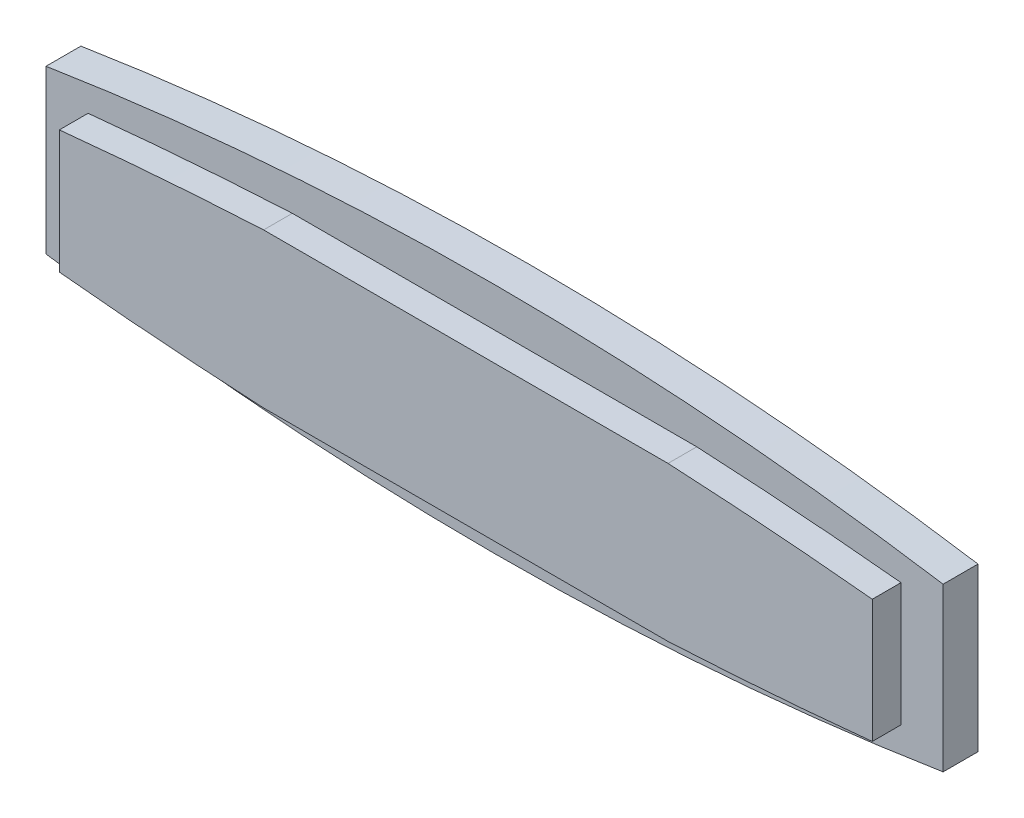
ISO-10303-21;
HEADER;
FILE_DESCRIPTION(('STEP AP214'),'2;1');
FILE_NAME('part.step','',(''),(''),'','','');
FILE_SCHEMA(('AUTOMOTIVE_DESIGN { 1 0 10303 214 1 1 1 1 }'));
ENDSEC;
DATA;
#1=APPLICATION_CONTEXT('core data for automotive mechanical design processes');
#2=APPLICATION_PROTOCOL_DEFINITION('international standard','automotive_design',2000,#1);
#3=PRODUCT_CONTEXT('',#1,'mechanical');
#4=PRODUCT('Part','Part','',(#3));
#5=PRODUCT_RELATED_PRODUCT_CATEGORY('part','',(#4));
#6=PRODUCT_DEFINITION_FORMATION('','',#4);
#7=PRODUCT_DEFINITION_CONTEXT('part definition',#1,'design');
#8=PRODUCT_DEFINITION('design','',#6,#7);
#9=PRODUCT_DEFINITION_SHAPE('','',#8);
#10=(LENGTH_UNIT() NAMED_UNIT(*) SI_UNIT(.MILLI.,.METRE.));
#11=(NAMED_UNIT(*) PLANE_ANGLE_UNIT() SI_UNIT($,.RADIAN.));
#12=(NAMED_UNIT(*) SI_UNIT($,.STERADIAN.) SOLID_ANGLE_UNIT());
#13=UNCERTAINTY_MEASURE_WITH_UNIT(LENGTH_MEASURE(1.E-05),#10,'distance_accuracy_value','');
#14=(GEOMETRIC_REPRESENTATION_CONTEXT(3) GLOBAL_UNCERTAINTY_ASSIGNED_CONTEXT((#13)) GLOBAL_UNIT_ASSIGNED_CONTEXT((#10,
#11,#12)) REPRESENTATION_CONTEXT('',''));
#15=CARTESIAN_POINT('',(0.,0.,0.));
#16=DIRECTION('',(0.,0.,1.));
#17=DIRECTION('',(1.,0.,0.));
#18=AXIS2_PLACEMENT_3D('',#15,#16,#17);
#19=CARTESIAN_POINT('',(21.85,-5.675,1.7));
#20=DIRECTION('',(0.,0.,1.));
#21=DIRECTION('',(1.,0.,0.));
#22=AXIS2_PLACEMENT_3D('',#19,#20,#21);
#23=PLANE('',#22);
#24=DIRECTION('',(0.,-1.,0.));
#25=VECTOR('',#24,1.);
#26=CARTESIAN_POINT('',(-21.85,5.675,1.7));
#27=LINE('',#26,#25);
#28=CARTESIAN_POINT('',(-21.85,3.95940801478667,1.7));
#29=VERTEX_POINT('',#28);
#30=CARTESIAN_POINT('',(-21.85,-3.95940801478667,1.7));
#31=VERTEX_POINT('',#30);
#32=EDGE_CURVE('E169',#29,#31,#27,.T.);
#33=ORIENTED_EDGE('',*,*,#32,.T.);
#34=CARTESIAN_POINT('',(0.,134.325,1.7));
#35=DIRECTION('',(0.,0.,1.));
#36=DIRECTION('',(1.,0.,0.));
#37=AXIS2_PLACEMENT_3D('',#34,#35,#36);
#38=CIRCLE('',#37,140.);
#39=CARTESIAN_POINT('',(21.85,-3.95940801478667,1.7));
#40=VERTEX_POINT('',#39);
#41=EDGE_CURVE('E145',#31,#40,#38,.T.);
#42=ORIENTED_EDGE('',*,*,#41,.T.);
#43=DIRECTION('',(0.,1.,0.));
#44=VECTOR('',#43,1.);
#45=CARTESIAN_POINT('',(21.85,5.675,1.7));
#46=LINE('',#45,#44);
#47=CARTESIAN_POINT('',(21.85,3.95940801478667,1.7));
#48=VERTEX_POINT('',#47);
#49=EDGE_CURVE('E166',#40,#48,#46,.T.);
#50=ORIENTED_EDGE('',*,*,#49,.T.);
#51=CARTESIAN_POINT('',(0.,-134.325,1.7));
#52=DIRECTION('',(0.,0.,1.));
#53=DIRECTION('',(1.,0.,0.));
#54=AXIS2_PLACEMENT_3D('',#51,#52,#53);
#55=CIRCLE('',#54,140.);
#56=EDGE_CURVE('E148',#48,#29,#55,.T.);
#57=ORIENTED_EDGE('',*,*,#56,.T.);
#58=EDGE_LOOP('',(#33,#42,#50,#57));
#59=FACE_BOUND('',#58,.T.);
#60=DIRECTION('',(0.,-1.,0.));
#61=VECTOR('',#60,1.);
#62=CARTESIAN_POINT('',(-19.8,3.,1.7));
#63=LINE('',#62,#61);
#64=CARTESIAN_POINT('',(-19.8,3.,1.7));
#65=VERTEX_POINT('',#64);
#66=CARTESIAN_POINT('',(-19.8,-3.,1.7));
#67=VERTEX_POINT('',#66);
#68=EDGE_CURVE('E329',#65,#67,#63,.T.);
#69=ORIENTED_EDGE('',*,*,#68,.F.);
#70=CARTESIAN_POINT('',(0.,-191.997333315099,1.7));
#71=DIRECTION('',(0.,0.,1.));
#72=DIRECTION('',(1.,0.,0.));
#73=AXIS2_PLACEMENT_3D('',#70,#71,#72);
#74=CIRCLE('',#73,196.);
#75=CARTESIAN_POINT('',(-9.85,3.75500383569932,1.7));
#76=VERTEX_POINT('',#75);
#77=EDGE_CURVE('E143',#76,#65,#74,.T.);
#78=ORIENTED_EDGE('',*,*,#77,.F.);
#79=DIRECTION('',(-1.,0.,0.));
#80=VECTOR('',#79,1.);
#81=CARTESIAN_POINT('',(-9.85,3.75500383569932,1.7));
#82=LINE('',#81,#80);
#83=CARTESIAN_POINT('',(9.84999999999999,3.75500383569932,1.7));
#84=VERTEX_POINT('',#83);
#85=EDGE_CURVE('E139',#84,#76,#82,.T.);
#86=ORIENTED_EDGE('',*,*,#85,.F.);
#87=CARTESIAN_POINT('',(0.,-191.997333315099,1.7));
#88=DIRECTION('',(0.,0.,1.));
#89=DIRECTION('',(1.,0.,0.));
#90=AXIS2_PLACEMENT_3D('',#87,#88,#89);
#91=CIRCLE('',#90,196.);
#92=CARTESIAN_POINT('',(19.8,3.,1.7));
#93=VERTEX_POINT('',#92);
#94=EDGE_CURVE('E325',#93,#84,#91,.T.);
#95=ORIENTED_EDGE('',*,*,#94,.F.);
#96=DIRECTION('',(0.,1.,0.));
#97=VECTOR('',#96,1.);
#98=CARTESIAN_POINT('',(19.8,-3.,1.7));
#99=LINE('',#98,#97);
#100=CARTESIAN_POINT('',(19.8,-3.,1.7));
#101=VERTEX_POINT('',#100);
#102=EDGE_CURVE('E341',#101,#93,#99,.T.);
#103=ORIENTED_EDGE('',*,*,#102,.F.);
#104=CARTESIAN_POINT('',(0.,191.997333315099,1.7));
#105=DIRECTION('',(0.,0.,1.));
#106=DIRECTION('',(-1.,0.,0.));
#107=AXIS2_PLACEMENT_3D('',#104,#105,#106);
#108=CIRCLE('',#107,196.);
#109=CARTESIAN_POINT('',(9.85,-3.75500383569932,1.7));
#110=VERTEX_POINT('',#109);
#111=EDGE_CURVE('E339',#110,#101,#108,.T.);
#112=ORIENTED_EDGE('',*,*,#111,.F.);
#113=DIRECTION('',(1.,0.,0.));
#114=VECTOR('',#113,1.);
#115=CARTESIAN_POINT('',(-9.85,-3.75500383569932,1.7));
#116=LINE('',#115,#114);
#117=CARTESIAN_POINT('',(-9.8499999999999,-3.75500383569932,1.7));
#118=VERTEX_POINT('',#117);
#119=EDGE_CURVE('E337',#118,#110,#116,.T.);
#120=ORIENTED_EDGE('',*,*,#119,.F.);
#121=CARTESIAN_POINT('',(0.,191.997333315099,1.7));
#122=DIRECTION('',(0.,0.,1.));
#123=DIRECTION('',(-1.,0.,0.));
#124=AXIS2_PLACEMENT_3D('',#121,#122,#123);
#125=CIRCLE('',#124,196.);
#126=EDGE_CURVE('E331',#67,#118,#125,.T.);
#127=ORIENTED_EDGE('',*,*,#126,.F.);
#128=EDGE_LOOP('',(#69,#78,#86,#95,#103,#112,#120,#127));
#129=FACE_BOUND('',#128,.T.);
#130=ADVANCED_FACE('F33',(#59,#129),#23,.T.);
#131=CARTESIAN_POINT('',(21.85,5.675,1.7));
#132=DIRECTION('',(-1.,0.,0.));
#133=DIRECTION('',(0.,-1.,0.));
#134=AXIS2_PLACEMENT_3D('',#131,#132,#133);
#135=PLANE('',#134);
#136=DIRECTION('',(0.,0.,1.));
#137=VECTOR('',#136,1.);
#138=CARTESIAN_POINT('',(21.85,-3.95940801478666,0.));
#139=LINE('',#138,#137);
#140=CARTESIAN_POINT('',(21.85,-3.95940801478667,0.));
#141=VERTEX_POINT('',#140);
#142=EDGE_CURVE('E163',#141,#40,#139,.T.);
#143=ORIENTED_EDGE('',*,*,#142,.F.);
#144=DIRECTION('',(0.,1.,0.));
#145=VECTOR('',#144,1.);
#146=CARTESIAN_POINT('',(21.85,5.675,0.));
#147=LINE('',#146,#145);
#148=CARTESIAN_POINT('',(21.85,3.95940801478667,0.));
#149=VERTEX_POINT('',#148);
#150=EDGE_CURVE('E165',#141,#149,#147,.T.);
#151=ORIENTED_EDGE('',*,*,#150,.T.);
#152=DIRECTION('',(0.,0.,1.));
#153=VECTOR('',#152,1.);
#154=CARTESIAN_POINT('',(21.85,3.95940801478668,0.));
#155=LINE('',#154,#153);
#156=EDGE_CURVE('E158',#48,#149,#155,.F.);
#157=ORIENTED_EDGE('',*,*,#156,.F.);
#158=ORIENTED_EDGE('',*,*,#49,.F.);
#159=EDGE_LOOP('',(#143,#151,#157,#158));
#160=FACE_BOUND('',#159,.T.);
#161=ADVANCED_FACE('F35',(#160),#135,.F.);
#162=CARTESIAN_POINT('',(-21.85,5.675,1.7));
#163=DIRECTION('',(1.,0.,0.));
#164=DIRECTION('',(0.,0.,-1.));
#165=AXIS2_PLACEMENT_3D('',#162,#163,#164);
#166=PLANE('',#165);
#167=DIRECTION('',(0.,0.,1.));
#168=VECTOR('',#167,1.);
#169=CARTESIAN_POINT('',(-21.85,-3.95940801478668,0.));
#170=LINE('',#169,#168);
#171=CARTESIAN_POINT('',(-21.85,-3.95940801478667,0.));
#172=VERTEX_POINT('',#171);
#173=EDGE_CURVE('E161',#31,#172,#170,.F.);
#174=ORIENTED_EDGE('',*,*,#173,.F.);
#175=ORIENTED_EDGE('',*,*,#32,.F.);
#176=DIRECTION('',(0.,0.,1.));
#177=VECTOR('',#176,1.);
#178=CARTESIAN_POINT('',(-21.85,3.95940801478668,0.));
#179=LINE('',#178,#177);
#180=CARTESIAN_POINT('',(-21.85,3.95940801478667,0.));
#181=VERTEX_POINT('',#180);
#182=EDGE_CURVE('E155',#181,#29,#179,.T.);
#183=ORIENTED_EDGE('',*,*,#182,.F.);
#184=DIRECTION('',(0.,-1.,0.));
#185=VECTOR('',#184,1.);
#186=CARTESIAN_POINT('',(-21.85,5.675,0.));
#187=LINE('',#186,#185);
#188=EDGE_CURVE('E170',#181,#172,#187,.T.);
#189=ORIENTED_EDGE('',*,*,#188,.T.);
#190=EDGE_LOOP('',(#174,#175,#183,#189));
#191=FACE_BOUND('',#190,.T.);
#192=ADVANCED_FACE('F186',(#191),#166,.F.);
#193=CARTESIAN_POINT('',(21.85,-5.675,0.));
#194=DIRECTION('',(0.,0.,1.));
#195=DIRECTION('',(1.,0.,0.));
#196=AXIS2_PLACEMENT_3D('',#193,#194,#195);
#197=PLANE('',#196);
#198=CARTESIAN_POINT('',(0.,134.325,0.));
#199=DIRECTION('',(0.,0.,1.));
#200=DIRECTION('',(1.,0.,0.));
#201=AXIS2_PLACEMENT_3D('',#198,#199,#200);
#202=CIRCLE('',#201,140.);
#203=EDGE_CURVE('E12',#172,#141,#202,.T.);
#204=ORIENTED_EDGE('',*,*,#203,.F.);
#205=ORIENTED_EDGE('',*,*,#188,.F.);
#206=CARTESIAN_POINT('',(0.,-134.325,0.));
#207=DIRECTION('',(0.,0.,1.));
#208=DIRECTION('',(1.,0.,0.));
#209=AXIS2_PLACEMENT_3D('',#206,#207,#208);
#210=CIRCLE('',#209,140.);
#211=EDGE_CURVE('E41',#149,#181,#210,.T.);
#212=ORIENTED_EDGE('',*,*,#211,.F.);
#213=ORIENTED_EDGE('',*,*,#150,.F.);
#214=EDGE_LOOP('',(#204,#205,#212,#213));
#215=FACE_BOUND('',#214,.T.);
#216=ADVANCED_FACE('F187',(#215),#197,.F.);
#217=CARTESIAN_POINT('',(0.,-134.325,0.));
#218=DIRECTION('',(0.,0.,1.));
#219=DIRECTION('',(1.,0.,0.));
#220=AXIS2_PLACEMENT_3D('',#217,#218,#219);
#221=CYLINDRICAL_SURFACE('',#220,140.);
#222=ORIENTED_EDGE('',*,*,#156,.T.);
#223=ORIENTED_EDGE('',*,*,#211,.T.);
#224=ORIENTED_EDGE('',*,*,#182,.T.);
#225=ORIENTED_EDGE('',*,*,#56,.F.);
#226=EDGE_LOOP('',(#222,#223,#224,#225));
#227=FACE_BOUND('',#226,.T.);
#228=ADVANCED_FACE('F178',(#227),#221,.T.);
#229=CARTESIAN_POINT('',(0.,134.325,0.));
#230=DIRECTION('',(0.,0.,1.));
#231=DIRECTION('',(1.,0.,0.));
#232=AXIS2_PLACEMENT_3D('',#229,#230,#231);
#233=CYLINDRICAL_SURFACE('',#232,140.);
#234=ORIENTED_EDGE('',*,*,#142,.T.);
#235=ORIENTED_EDGE('',*,*,#41,.F.);
#236=ORIENTED_EDGE('',*,*,#173,.T.);
#237=ORIENTED_EDGE('',*,*,#203,.T.);
#238=EDGE_LOOP('',(#234,#235,#236,#237));
#239=FACE_BOUND('',#238,.T.);
#240=ADVANCED_FACE('F188',(#239),#233,.T.);
#241=CARTESIAN_POINT('',(0.,-191.997333315099,3.1));
#242=DIRECTION('',(0.,0.,-1.));
#243=DIRECTION('',(-1.,0.,0.));
#244=AXIS2_PLACEMENT_3D('',#241,#242,#243);
#245=CYLINDRICAL_SURFACE('',#244,196.);
#246=ORIENTED_EDGE('',*,*,#77,.T.);
#247=DIRECTION('',(0.,0.,-1.));
#248=VECTOR('',#247,1.);
#249=CARTESIAN_POINT('',(-19.8,3.,3.1));
#250=LINE('',#249,#248);
#251=CARTESIAN_POINT('',(-19.8,3.,3.1));
#252=VERTEX_POINT('',#251);
#253=EDGE_CURVE('E124',#252,#65,#250,.T.);
#254=ORIENTED_EDGE('',*,*,#253,.F.);
#255=CARTESIAN_POINT('',(0.,-191.997333315099,3.1));
#256=DIRECTION('',(0.,0.,1.));
#257=DIRECTION('',(1.,0.,0.));
#258=AXIS2_PLACEMENT_3D('',#255,#256,#257);
#259=CIRCLE('',#258,196.);
#260=CARTESIAN_POINT('',(-9.85,3.75500383569932,3.1));
#261=VERTEX_POINT('',#260);
#262=EDGE_CURVE('E131',#261,#252,#259,.T.);
#263=ORIENTED_EDGE('',*,*,#262,.F.);
#264=DIRECTION('',(0.,0.,-1.));
#265=VECTOR('',#264,1.);
#266=CARTESIAN_POINT('',(-9.85,3.75500383569932,3.1));
#267=LINE('',#266,#265);
#268=EDGE_CURVE('E323',#261,#76,#267,.T.);
#269=ORIENTED_EDGE('',*,*,#268,.T.);
#270=EDGE_LOOP('',(#246,#254,#263,#269));
#271=FACE_BOUND('',#270,.T.);
#272=ADVANCED_FACE('F141',(#271),#245,.T.);
#273=CARTESIAN_POINT('',(-19.8,3.,3.1));
#274=DIRECTION('',(1.,0.,0.));
#275=DIRECTION('',(0.,0.,-1.));
#276=AXIS2_PLACEMENT_3D('',#273,#274,#275);
#277=PLANE('',#276);
#278=ORIENTED_EDGE('',*,*,#68,.T.);
#279=DIRECTION('',(0.,0.,-1.));
#280=VECTOR('',#279,1.);
#281=CARTESIAN_POINT('',(-19.8,-3.,3.1));
#282=LINE('',#281,#280);
#283=CARTESIAN_POINT('',(-19.8,-3.,3.1));
#284=VERTEX_POINT('',#283);
#285=EDGE_CURVE('E127',#284,#67,#282,.T.);
#286=ORIENTED_EDGE('',*,*,#285,.F.);
#287=DIRECTION('',(0.,-1.,0.));
#288=VECTOR('',#287,1.);
#289=CARTESIAN_POINT('',(-19.8,3.,3.1));
#290=LINE('',#289,#288);
#291=EDGE_CURVE('E120',#252,#284,#290,.T.);
#292=ORIENTED_EDGE('',*,*,#291,.F.);
#293=ORIENTED_EDGE('',*,*,#253,.T.);
#294=EDGE_LOOP('',(#278,#286,#292,#293));
#295=FACE_BOUND('',#294,.T.);
#296=ADVANCED_FACE('F122',(#295),#277,.F.);
#297=CARTESIAN_POINT('',(0.,191.997333315099,3.1));
#298=DIRECTION('',(0.,0.,-1.));
#299=DIRECTION('',(-1.,0.,0.));
#300=AXIS2_PLACEMENT_3D('',#297,#298,#299);
#301=CYLINDRICAL_SURFACE('',#300,196.);
#302=ORIENTED_EDGE('',*,*,#126,.T.);
#303=DIRECTION('',(0.,0.,-1.));
#304=VECTOR('',#303,1.);
#305=CARTESIAN_POINT('',(-9.8499999999999,-3.75500383569932,3.1));
#306=LINE('',#305,#304);
#307=CARTESIAN_POINT('',(-9.8499999999999,-3.75500383569932,3.1));
#308=VERTEX_POINT('',#307);
#309=EDGE_CURVE('E150',#308,#118,#306,.T.);
#310=ORIENTED_EDGE('',*,*,#309,.F.);
#311=CARTESIAN_POINT('',(0.,191.997333315099,3.1));
#312=DIRECTION('',(0.,0.,1.));
#313=DIRECTION('',(-1.,0.,0.));
#314=AXIS2_PLACEMENT_3D('',#311,#312,#313);
#315=CIRCLE('',#314,196.);
#316=EDGE_CURVE('E130',#284,#308,#315,.T.);
#317=ORIENTED_EDGE('',*,*,#316,.F.);
#318=ORIENTED_EDGE('',*,*,#285,.T.);
#319=EDGE_LOOP('',(#302,#310,#317,#318));
#320=FACE_BOUND('',#319,.T.);
#321=ADVANCED_FACE('F216',(#320),#301,.T.);
#322=CARTESIAN_POINT('',(-9.85,-3.75500383569932,3.1));
#323=DIRECTION('',(0.,1.,0.));
#324=DIRECTION('',(0.,0.,1.));
#325=AXIS2_PLACEMENT_3D('',#322,#323,#324);
#326=PLANE('',#325);
#327=ORIENTED_EDGE('',*,*,#119,.T.);
#328=DIRECTION('',(0.,0.,-1.));
#329=VECTOR('',#328,1.);
#330=CARTESIAN_POINT('',(9.85,-3.75500383569932,3.1));
#331=LINE('',#330,#329);
#332=CARTESIAN_POINT('',(9.85,-3.75500383569932,3.1));
#333=VERTEX_POINT('',#332);
#334=EDGE_CURVE('E351',#333,#110,#331,.T.);
#335=ORIENTED_EDGE('',*,*,#334,.F.);
#336=DIRECTION('',(1.,0.,0.));
#337=VECTOR('',#336,1.);
#338=CARTESIAN_POINT('',(-9.85,-3.75500383569932,3.1));
#339=LINE('',#338,#337);
#340=EDGE_CURVE('E358',#308,#333,#339,.T.);
#341=ORIENTED_EDGE('',*,*,#340,.F.);
#342=ORIENTED_EDGE('',*,*,#309,.T.);
#343=EDGE_LOOP('',(#327,#335,#341,#342));
#344=FACE_BOUND('',#343,.T.);
#345=ADVANCED_FACE('F219',(#344),#326,.F.);
#346=CARTESIAN_POINT('',(0.,191.997333315099,3.1));
#347=DIRECTION('',(0.,0.,-1.));
#348=DIRECTION('',(-1.,0.,0.));
#349=AXIS2_PLACEMENT_3D('',#346,#347,#348);
#350=CYLINDRICAL_SURFACE('',#349,196.);
#351=ORIENTED_EDGE('',*,*,#111,.T.);
#352=DIRECTION('',(0.,0.,-1.));
#353=VECTOR('',#352,1.);
#354=CARTESIAN_POINT('',(19.8,-3.,3.1));
#355=LINE('',#354,#353);
#356=CARTESIAN_POINT('',(19.8,-3.,3.1));
#357=VERTEX_POINT('',#356);
#358=EDGE_CURVE('E348',#357,#101,#355,.T.);
#359=ORIENTED_EDGE('',*,*,#358,.F.);
#360=CARTESIAN_POINT('',(0.,191.997333315099,3.1));
#361=DIRECTION('',(0.,0.,1.));
#362=DIRECTION('',(-1.,0.,0.));
#363=AXIS2_PLACEMENT_3D('',#360,#361,#362);
#364=CIRCLE('',#363,196.);
#365=EDGE_CURVE('E368',#333,#357,#364,.T.);
#366=ORIENTED_EDGE('',*,*,#365,.F.);
#367=ORIENTED_EDGE('',*,*,#334,.T.);
#368=EDGE_LOOP('',(#351,#359,#366,#367));
#369=FACE_BOUND('',#368,.T.);
#370=ADVANCED_FACE('F223',(#369),#350,.T.);
#371=CARTESIAN_POINT('',(19.8,-3.,3.1));
#372=DIRECTION('',(-1.,0.,0.));
#373=DIRECTION('',(0.,0.,1.));
#374=AXIS2_PLACEMENT_3D('',#371,#372,#373);
#375=PLANE('',#374);
#376=ORIENTED_EDGE('',*,*,#102,.T.);
#377=DIRECTION('',(0.,0.,-1.));
#378=VECTOR('',#377,1.);
#379=CARTESIAN_POINT('',(19.8,3.,3.1));
#380=LINE('',#379,#378);
#381=CARTESIAN_POINT('',(19.8,3.,3.1));
#382=VERTEX_POINT('',#381);
#383=EDGE_CURVE('E345',#382,#93,#380,.T.);
#384=ORIENTED_EDGE('',*,*,#383,.F.);
#385=DIRECTION('',(0.,1.,0.));
#386=VECTOR('',#385,1.);
#387=CARTESIAN_POINT('',(19.8,-3.,3.1));
#388=LINE('',#387,#386);
#389=EDGE_CURVE('E365',#357,#382,#388,.T.);
#390=ORIENTED_EDGE('',*,*,#389,.F.);
#391=ORIENTED_EDGE('',*,*,#358,.T.);
#392=EDGE_LOOP('',(#376,#384,#390,#391));
#393=FACE_BOUND('',#392,.T.);
#394=ADVANCED_FACE('F227',(#393),#375,.F.);
#395=CARTESIAN_POINT('',(0.,-191.997333315099,3.1));
#396=DIRECTION('',(0.,0.,-1.));
#397=DIRECTION('',(-1.,0.,0.));
#398=AXIS2_PLACEMENT_3D('',#395,#396,#397);
#399=CYLINDRICAL_SURFACE('',#398,196.);
#400=ORIENTED_EDGE('',*,*,#94,.T.);
#401=DIRECTION('',(0.,0.,-1.));
#402=VECTOR('',#401,1.);
#403=CARTESIAN_POINT('',(9.84999999999999,3.75500383569932,3.1));
#404=LINE('',#403,#402);
#405=CARTESIAN_POINT('',(9.84999999999999,3.75500383569932,3.1));
#406=VERTEX_POINT('',#405);
#407=EDGE_CURVE('E48',#406,#84,#404,.T.);
#408=ORIENTED_EDGE('',*,*,#407,.F.);
#409=CARTESIAN_POINT('',(0.,-191.997333315099,3.1));
#410=DIRECTION('',(0.,0.,1.));
#411=DIRECTION('',(1.,0.,0.));
#412=AXIS2_PLACEMENT_3D('',#409,#410,#411);
#413=CIRCLE('',#412,196.);
#414=EDGE_CURVE('E367',#382,#406,#413,.T.);
#415=ORIENTED_EDGE('',*,*,#414,.F.);
#416=ORIENTED_EDGE('',*,*,#383,.T.);
#417=EDGE_LOOP('',(#400,#408,#415,#416));
#418=FACE_BOUND('',#417,.T.);
#419=ADVANCED_FACE('F231',(#418),#399,.T.);
#420=CARTESIAN_POINT('',(-9.85,3.75500383569932,3.1));
#421=DIRECTION('',(0.,-1.,0.));
#422=DIRECTION('',(0.,0.,-1.));
#423=AXIS2_PLACEMENT_3D('',#420,#421,#422);
#424=PLANE('',#423);
#425=ORIENTED_EDGE('',*,*,#85,.T.);
#426=ORIENTED_EDGE('',*,*,#268,.F.);
#427=DIRECTION('',(-1.,0.,0.));
#428=VECTOR('',#427,1.);
#429=CARTESIAN_POINT('',(-9.85,3.75500383569932,3.1));
#430=LINE('',#429,#428);
#431=EDGE_CURVE('E135',#406,#261,#430,.T.);
#432=ORIENTED_EDGE('',*,*,#431,.F.);
#433=ORIENTED_EDGE('',*,*,#407,.T.);
#434=EDGE_LOOP('',(#425,#426,#432,#433));
#435=FACE_BOUND('',#434,.T.);
#436=ADVANCED_FACE('F235',(#435),#424,.F.);
#437=CARTESIAN_POINT('',(0.,-191.997333315099,3.1));
#438=DIRECTION('',(0.,0.,1.));
#439=DIRECTION('',(1.,0.,0.));
#440=AXIS2_PLACEMENT_3D('',#437,#438,#439);
#441=PLANE('',#440);
#442=ORIENTED_EDGE('',*,*,#262,.T.);
#443=ORIENTED_EDGE('',*,*,#291,.T.);
#444=ORIENTED_EDGE('',*,*,#316,.T.);
#445=ORIENTED_EDGE('',*,*,#340,.T.);
#446=ORIENTED_EDGE('',*,*,#365,.T.);
#447=ORIENTED_EDGE('',*,*,#389,.T.);
#448=ORIENTED_EDGE('',*,*,#414,.T.);
#449=ORIENTED_EDGE('',*,*,#431,.T.);
#450=EDGE_LOOP('',(#442,#443,#444,#445,#446,#447,#448,#449));
#451=FACE_BOUND('',#450,.T.);
#452=ADVANCED_FACE('F134',(#451),#441,.T.);
#453=CLOSED_SHELL('',(#130,#161,#192,#216,#228,#240,#272,#296,#321,#345,#370,#394,#419,#436,#452));
#454=MANIFOLD_SOLID_BREP('B2',#453);
#455=ADVANCED_BREP_SHAPE_REPRESENTATION('',(#18,#454),#14);
#456=SHAPE_DEFINITION_REPRESENTATION(#9,#455);
ENDSEC;
END-ISO-10303-21;
